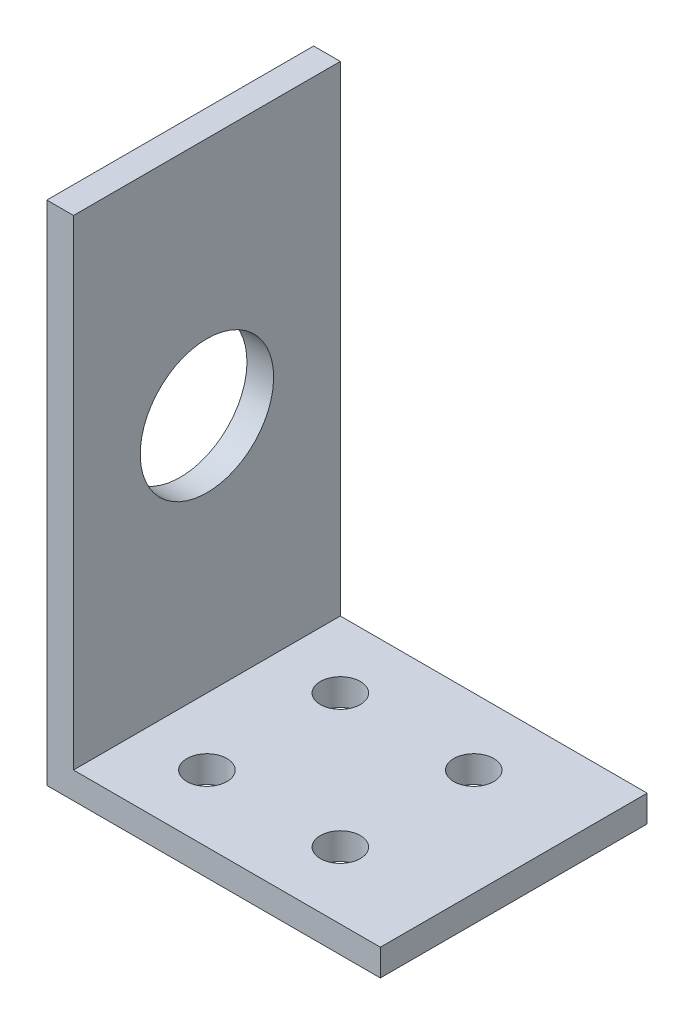
ISO-10303-21;
HEADER;
FILE_DESCRIPTION(('STEP AP214'),'2;1');
FILE_NAME('part.step','',(''),(''),'','','');
FILE_SCHEMA(('AUTOMOTIVE_DESIGN { 1 0 10303 214 1 1 1 1 }'));
ENDSEC;
DATA;
#1=APPLICATION_CONTEXT('core data for automotive mechanical design processes');
#2=APPLICATION_PROTOCOL_DEFINITION('international standard','automotive_design',2000,#1);
#3=PRODUCT_CONTEXT('',#1,'mechanical');
#4=PRODUCT('Part','Part','',(#3));
#5=PRODUCT_RELATED_PRODUCT_CATEGORY('part','',(#4));
#6=PRODUCT_DEFINITION_FORMATION('','',#4);
#7=PRODUCT_DEFINITION_CONTEXT('part definition',#1,'design');
#8=PRODUCT_DEFINITION('design','',#6,#7);
#9=PRODUCT_DEFINITION_SHAPE('','',#8);
#10=(LENGTH_UNIT() NAMED_UNIT(*) SI_UNIT(.MILLI.,.METRE.));
#11=(NAMED_UNIT(*) PLANE_ANGLE_UNIT() SI_UNIT($,.RADIAN.));
#12=(NAMED_UNIT(*) SI_UNIT($,.STERADIAN.) SOLID_ANGLE_UNIT());
#13=UNCERTAINTY_MEASURE_WITH_UNIT(LENGTH_MEASURE(1.E-05),#10,'distance_accuracy_value','');
#14=(GEOMETRIC_REPRESENTATION_CONTEXT(3) GLOBAL_UNCERTAINTY_ASSIGNED_CONTEXT((#13)) GLOBAL_UNIT_ASSIGNED_CONTEXT((#10,
#11,#12)) REPRESENTATION_CONTEXT('',''));
#15=CARTESIAN_POINT('',(0.,0.,0.));
#16=DIRECTION('',(0.,0.,1.));
#17=DIRECTION('',(1.,0.,0.));
#18=AXIS2_PLACEMENT_3D('',#15,#16,#17);
#19=CARTESIAN_POINT('',(2.,38.,20.));
#20=DIRECTION('',(0.,-1.,0.));
#21=DIRECTION('',(0.,0.,-1.));
#22=AXIS2_PLACEMENT_3D('',#19,#20,#21);
#23=PLANE('',#22);
#24=DIRECTION('',(-1.,0.,0.));
#25=VECTOR('',#24,1.);
#26=CARTESIAN_POINT('',(2.,38.,0.));
#27=LINE('',#26,#25);
#28=CARTESIAN_POINT('',(2.,38.,0.));
#29=VERTEX_POINT('',#28);
#30=CARTESIAN_POINT('',(0.,38.,0.));
#31=VERTEX_POINT('',#30);
#32=EDGE_CURVE('E128',#29,#31,#27,.T.);
#33=ORIENTED_EDGE('',*,*,#32,.T.);
#34=DIRECTION('',(0.,0.,-1.));
#35=VECTOR('',#34,1.);
#36=CARTESIAN_POINT('',(0.,38.,20.));
#37=LINE('',#36,#35);
#38=CARTESIAN_POINT('',(0.,38.,20.));
#39=VERTEX_POINT('',#38);
#40=EDGE_CURVE('E11',#39,#31,#37,.T.);
#41=ORIENTED_EDGE('',*,*,#40,.F.);
#42=DIRECTION('',(-1.,0.,0.));
#43=VECTOR('',#42,1.);
#44=CARTESIAN_POINT('',(2.,38.,20.));
#45=LINE('',#44,#43);
#46=CARTESIAN_POINT('',(2.,38.,20.));
#47=VERTEX_POINT('',#46);
#48=EDGE_CURVE('E145',#47,#39,#45,.T.);
#49=ORIENTED_EDGE('',*,*,#48,.F.);
#50=DIRECTION('',(0.,0.,-1.));
#51=VECTOR('',#50,1.);
#52=CARTESIAN_POINT('',(2.,38.,20.));
#53=LINE('',#52,#51);
#54=EDGE_CURVE('E124',#47,#29,#53,.T.);
#55=ORIENTED_EDGE('',*,*,#54,.T.);
#56=EDGE_LOOP('',(#33,#41,#49,#55));
#57=FACE_BOUND('',#56,.T.);
#58=ADVANCED_FACE('F39',(#57),#23,.F.);
#59=CARTESIAN_POINT('',(0.,38.,20.));
#60=DIRECTION('',(1.,0.,0.));
#61=DIRECTION('',(0.,1.,0.));
#62=AXIS2_PLACEMENT_3D('',#59,#60,#61);
#63=PLANE('',#62);
#64=CARTESIAN_POINT('',(0.,20.,10.));
#65=DIRECTION('',(1.,0.,0.));
#66=DIRECTION('',(0.,1.,0.));
#67=AXIS2_PLACEMENT_3D('',#64,#65,#66);
#68=CIRCLE('',#67,5.);
#69=CARTESIAN_POINT('',(0.,25.,10.));
#70=VERTEX_POINT('',#69);
#71=EDGE_CURVE('E279',#70,#70,#68,.T.);
#72=ORIENTED_EDGE('',*,*,#71,.T.);
#73=EDGE_LOOP('',(#72));
#74=FACE_BOUND('',#73,.T.);
#75=DIRECTION('',(0.,-1.,0.));
#76=VECTOR('',#75,1.);
#77=CARTESIAN_POINT('',(0.,38.,0.));
#78=LINE('',#77,#76);
#79=CARTESIAN_POINT('',(0.,0.,0.));
#80=VERTEX_POINT('',#79);
#81=EDGE_CURVE('E132',#31,#80,#78,.T.);
#82=ORIENTED_EDGE('',*,*,#81,.T.);
#83=DIRECTION('',(0.,0.,-1.));
#84=VECTOR('',#83,1.);
#85=CARTESIAN_POINT('',(0.,0.,20.));
#86=LINE('',#85,#84);
#87=CARTESIAN_POINT('',(0.,0.,20.));
#88=VERTEX_POINT('',#87);
#89=EDGE_CURVE('E48',#88,#80,#86,.T.);
#90=ORIENTED_EDGE('',*,*,#89,.F.);
#91=DIRECTION('',(0.,-1.,0.));
#92=VECTOR('',#91,1.);
#93=CARTESIAN_POINT('',(0.,38.,20.));
#94=LINE('',#93,#92);
#95=EDGE_CURVE('E93',#39,#88,#94,.T.);
#96=ORIENTED_EDGE('',*,*,#95,.F.);
#97=ORIENTED_EDGE('',*,*,#40,.T.);
#98=EDGE_LOOP('',(#82,#90,#96,#97));
#99=FACE_BOUND('',#98,.T.);
#100=ADVANCED_FACE('F176',(#74,#99),#63,.F.);
#101=CARTESIAN_POINT('',(0.,0.,20.));
#102=DIRECTION('',(0.,1.,0.));
#103=DIRECTION('',(0.,0.,1.));
#104=AXIS2_PLACEMENT_3D('',#101,#102,#103);
#105=PLANE('',#104);
#106=CARTESIAN_POINT('',(17.,0.,15.));
#107=DIRECTION('',(0.,1.,0.));
#108=DIRECTION('',(0.,0.,1.));
#109=AXIS2_PLACEMENT_3D('',#106,#107,#108);
#110=CIRCLE('',#109,1.5);
#111=CARTESIAN_POINT('',(17.,0.,16.5));
#112=VERTEX_POINT('',#111);
#113=EDGE_CURVE('E305',#112,#112,#110,.T.);
#114=ORIENTED_EDGE('',*,*,#113,.T.);
#115=EDGE_LOOP('',(#114));
#116=FACE_BOUND('',#115,.T.);
#117=CARTESIAN_POINT('',(7.,0.,5.));
#118=DIRECTION('',(0.,1.,0.));
#119=DIRECTION('',(0.,0.,1.));
#120=AXIS2_PLACEMENT_3D('',#117,#118,#119);
#121=CIRCLE('',#120,1.5);
#122=CARTESIAN_POINT('',(7.,0.,6.5));
#123=VERTEX_POINT('',#122);
#124=EDGE_CURVE('E301',#123,#123,#121,.T.);
#125=ORIENTED_EDGE('',*,*,#124,.T.);
#126=EDGE_LOOP('',(#125));
#127=FACE_BOUND('',#126,.T.);
#128=CARTESIAN_POINT('',(7.,0.,15.));
#129=DIRECTION('',(0.,1.,0.));
#130=DIRECTION('',(0.,0.,1.));
#131=AXIS2_PLACEMENT_3D('',#128,#129,#130);
#132=CIRCLE('',#131,1.5);
#133=CARTESIAN_POINT('',(7.,0.,16.5));
#134=VERTEX_POINT('',#133);
#135=EDGE_CURVE('E294',#134,#134,#132,.T.);
#136=ORIENTED_EDGE('',*,*,#135,.T.);
#137=EDGE_LOOP('',(#136));
#138=FACE_BOUND('',#137,.T.);
#139=CARTESIAN_POINT('',(17.,0.,5.));
#140=DIRECTION('',(0.,1.,0.));
#141=DIRECTION('',(0.,0.,1.));
#142=AXIS2_PLACEMENT_3D('',#139,#140,#141);
#143=CIRCLE('',#142,1.5);
#144=CARTESIAN_POINT('',(17.,0.,6.5));
#145=VERTEX_POINT('',#144);
#146=EDGE_CURVE('E133',#145,#145,#143,.T.);
#147=ORIENTED_EDGE('',*,*,#146,.T.);
#148=EDGE_LOOP('',(#147));
#149=FACE_BOUND('',#148,.T.);
#150=DIRECTION('',(1.,0.,0.));
#151=VECTOR('',#150,1.);
#152=CARTESIAN_POINT('',(0.,0.,0.));
#153=LINE('',#152,#151);
#154=CARTESIAN_POINT('',(25.,0.,0.));
#155=VERTEX_POINT('',#154);
#156=EDGE_CURVE('E136',#80,#155,#153,.T.);
#157=ORIENTED_EDGE('',*,*,#156,.T.);
#158=DIRECTION('',(0.,0.,-1.));
#159=VECTOR('',#158,1.);
#160=CARTESIAN_POINT('',(25.,0.,20.));
#161=LINE('',#160,#159);
#162=CARTESIAN_POINT('',(25.,0.,20.));
#163=VERTEX_POINT('',#162);
#164=EDGE_CURVE('E117',#163,#155,#161,.T.);
#165=ORIENTED_EDGE('',*,*,#164,.F.);
#166=DIRECTION('',(1.,0.,0.));
#167=VECTOR('',#166,1.);
#168=CARTESIAN_POINT('',(0.,0.,20.));
#169=LINE('',#168,#167);
#170=EDGE_CURVE('E106',#88,#163,#169,.T.);
#171=ORIENTED_EDGE('',*,*,#170,.F.);
#172=ORIENTED_EDGE('',*,*,#89,.T.);
#173=EDGE_LOOP('',(#157,#165,#171,#172));
#174=FACE_BOUND('',#173,.T.);
#175=ADVANCED_FACE('F155',(#116,#127,#138,#149,#174),#105,.F.);
#176=CARTESIAN_POINT('',(25.,0.,20.));
#177=DIRECTION('',(-1.,0.,0.));
#178=DIRECTION('',(0.,0.,1.));
#179=AXIS2_PLACEMENT_3D('',#176,#177,#178);
#180=PLANE('',#179);
#181=DIRECTION('',(0.,1.,0.));
#182=VECTOR('',#181,1.);
#183=CARTESIAN_POINT('',(25.,0.,0.));
#184=LINE('',#183,#182);
#185=CARTESIAN_POINT('',(25.,2.,0.));
#186=VERTEX_POINT('',#185);
#187=EDGE_CURVE('E115',#155,#186,#184,.T.);
#188=ORIENTED_EDGE('',*,*,#187,.T.);
#189=DIRECTION('',(0.,0.,-1.));
#190=VECTOR('',#189,1.);
#191=CARTESIAN_POINT('',(25.,2.,20.));
#192=LINE('',#191,#190);
#193=CARTESIAN_POINT('',(25.,2.,20.));
#194=VERTEX_POINT('',#193);
#195=EDGE_CURVE('E112',#194,#186,#192,.T.);
#196=ORIENTED_EDGE('',*,*,#195,.F.);
#197=DIRECTION('',(0.,1.,0.));
#198=VECTOR('',#197,1.);
#199=CARTESIAN_POINT('',(25.,0.,20.));
#200=LINE('',#199,#198);
#201=EDGE_CURVE('E100',#163,#194,#200,.T.);
#202=ORIENTED_EDGE('',*,*,#201,.F.);
#203=ORIENTED_EDGE('',*,*,#164,.T.);
#204=EDGE_LOOP('',(#188,#196,#202,#203));
#205=FACE_BOUND('',#204,.T.);
#206=ADVANCED_FACE('F113',(#205),#180,.F.);
#207=CARTESIAN_POINT('',(25.,2.,20.));
#208=DIRECTION('',(0.,-1.,0.));
#209=DIRECTION('',(1.,0.,0.));
#210=AXIS2_PLACEMENT_3D('',#207,#208,#209);
#211=PLANE('',#210);
#212=CARTESIAN_POINT('',(17.,2.,15.));
#213=DIRECTION('',(0.,1.,0.));
#214=DIRECTION('',(-1.,0.,0.));
#215=AXIS2_PLACEMENT_3D('',#212,#213,#214);
#216=CIRCLE('',#215,1.5);
#217=CARTESIAN_POINT('',(15.5,2.,15.));
#218=VERTEX_POINT('',#217);
#219=EDGE_CURVE('E290',#218,#218,#216,.T.);
#220=ORIENTED_EDGE('',*,*,#219,.F.);
#221=EDGE_LOOP('',(#220));
#222=FACE_BOUND('',#221,.T.);
#223=CARTESIAN_POINT('',(7.,2.,5.));
#224=DIRECTION('',(0.,1.,0.));
#225=DIRECTION('',(-1.,0.,0.));
#226=AXIS2_PLACEMENT_3D('',#223,#224,#225);
#227=CIRCLE('',#226,1.5);
#228=CARTESIAN_POINT('',(5.5,2.,5.));
#229=VERTEX_POINT('',#228);
#230=EDGE_CURVE('E286',#229,#229,#227,.T.);
#231=ORIENTED_EDGE('',*,*,#230,.F.);
#232=EDGE_LOOP('',(#231));
#233=FACE_BOUND('',#232,.T.);
#234=CARTESIAN_POINT('',(7.,2.,15.));
#235=DIRECTION('',(0.,1.,0.));
#236=DIRECTION('',(-1.,0.,0.));
#237=AXIS2_PLACEMENT_3D('',#234,#235,#236);
#238=CIRCLE('',#237,1.5);
#239=CARTESIAN_POINT('',(5.5,2.,15.));
#240=VERTEX_POINT('',#239);
#241=EDGE_CURVE('E281',#240,#240,#238,.T.);
#242=ORIENTED_EDGE('',*,*,#241,.F.);
#243=EDGE_LOOP('',(#242));
#244=FACE_BOUND('',#243,.T.);
#245=CARTESIAN_POINT('',(17.,2.,5.));
#246=DIRECTION('',(0.,1.,0.));
#247=DIRECTION('',(-1.,0.,0.));
#248=AXIS2_PLACEMENT_3D('',#245,#246,#247);
#249=CIRCLE('',#248,1.5);
#250=CARTESIAN_POINT('',(15.5,2.,5.));
#251=VERTEX_POINT('',#250);
#252=EDGE_CURVE('E309',#251,#251,#249,.T.);
#253=ORIENTED_EDGE('',*,*,#252,.F.);
#254=EDGE_LOOP('',(#253));
#255=FACE_BOUND('',#254,.T.);
#256=DIRECTION('',(-1.,0.,0.));
#257=VECTOR('',#256,1.);
#258=CARTESIAN_POINT('',(25.,2.,0.));
#259=LINE('',#258,#257);
#260=CARTESIAN_POINT('',(2.,2.,0.));
#261=VERTEX_POINT('',#260);
#262=EDGE_CURVE('E79',#186,#261,#259,.T.);
#263=ORIENTED_EDGE('',*,*,#262,.T.);
#264=DIRECTION('',(0.,0.,-1.));
#265=VECTOR('',#264,1.);
#266=CARTESIAN_POINT('',(2.,2.,20.));
#267=LINE('',#266,#265);
#268=CARTESIAN_POINT('',(2.,2.,20.));
#269=VERTEX_POINT('',#268);
#270=EDGE_CURVE('E118',#269,#261,#267,.T.);
#271=ORIENTED_EDGE('',*,*,#270,.F.);
#272=DIRECTION('',(-1.,0.,0.));
#273=VECTOR('',#272,1.);
#274=CARTESIAN_POINT('',(25.,2.,20.));
#275=LINE('',#274,#273);
#276=EDGE_CURVE('E104',#194,#269,#275,.T.);
#277=ORIENTED_EDGE('',*,*,#276,.F.);
#278=ORIENTED_EDGE('',*,*,#195,.T.);
#279=EDGE_LOOP('',(#263,#271,#277,#278));
#280=FACE_BOUND('',#279,.T.);
#281=ADVANCED_FACE('F120',(#222,#233,#244,#255,#280),#211,.F.);
#282=CARTESIAN_POINT('',(2.,2.,20.));
#283=DIRECTION('',(-1.,0.,0.));
#284=DIRECTION('',(0.,-1.,0.));
#285=AXIS2_PLACEMENT_3D('',#282,#283,#284);
#286=PLANE('',#285);
#287=CARTESIAN_POINT('',(2.,20.,10.));
#288=DIRECTION('',(1.,0.,0.));
#289=DIRECTION('',(0.,1.,0.));
#290=AXIS2_PLACEMENT_3D('',#287,#288,#289);
#291=CIRCLE('',#290,5.);
#292=CARTESIAN_POINT('',(2.,25.,10.));
#293=VERTEX_POINT('',#292);
#294=EDGE_CURVE('E277',#293,#293,#291,.T.);
#295=ORIENTED_EDGE('',*,*,#294,.F.);
#296=EDGE_LOOP('',(#295));
#297=FACE_BOUND('',#296,.T.);
#298=DIRECTION('',(0.,1.,0.));
#299=VECTOR('',#298,1.);
#300=CARTESIAN_POINT('',(2.,2.,0.));
#301=LINE('',#300,#299);
#302=EDGE_CURVE('E85',#261,#29,#301,.T.);
#303=ORIENTED_EDGE('',*,*,#302,.T.);
#304=ORIENTED_EDGE('',*,*,#54,.F.);
#305=DIRECTION('',(0.,1.,0.));
#306=VECTOR('',#305,1.);
#307=CARTESIAN_POINT('',(2.,2.,20.));
#308=LINE('',#307,#306);
#309=EDGE_CURVE('E56',#269,#47,#308,.T.);
#310=ORIENTED_EDGE('',*,*,#309,.F.);
#311=ORIENTED_EDGE('',*,*,#270,.T.);
#312=EDGE_LOOP('',(#303,#304,#310,#311));
#313=FACE_BOUND('',#312,.T.);
#314=ADVANCED_FACE('F162',(#297,#313),#286,.F.);
#315=CARTESIAN_POINT('',(0.,0.,20.));
#316=DIRECTION('',(0.,0.,1.));
#317=DIRECTION('',(1.,0.,0.));
#318=AXIS2_PLACEMENT_3D('',#315,#316,#317);
#319=PLANE('',#318);
#320=ORIENTED_EDGE('',*,*,#48,.T.);
#321=ORIENTED_EDGE('',*,*,#95,.T.);
#322=ORIENTED_EDGE('',*,*,#170,.T.);
#323=ORIENTED_EDGE('',*,*,#201,.T.);
#324=ORIENTED_EDGE('',*,*,#276,.T.);
#325=ORIENTED_EDGE('',*,*,#309,.T.);
#326=EDGE_LOOP('',(#320,#321,#322,#323,#324,#325));
#327=FACE_BOUND('',#326,.T.);
#328=ADVANCED_FACE('F102',(#327),#319,.T.);
#329=CARTESIAN_POINT('',(0.,0.,0.));
#330=DIRECTION('',(0.,0.,1.));
#331=DIRECTION('',(1.,0.,0.));
#332=AXIS2_PLACEMENT_3D('',#329,#330,#331);
#333=PLANE('',#332);
#334=ORIENTED_EDGE('',*,*,#32,.F.);
#335=ORIENTED_EDGE('',*,*,#302,.F.);
#336=ORIENTED_EDGE('',*,*,#262,.F.);
#337=ORIENTED_EDGE('',*,*,#187,.F.);
#338=ORIENTED_EDGE('',*,*,#156,.F.);
#339=ORIENTED_EDGE('',*,*,#81,.F.);
#340=EDGE_LOOP('',(#334,#335,#336,#337,#338,#339));
#341=FACE_BOUND('',#340,.T.);
#342=ADVANCED_FACE('F158',(#341),#333,.F.);
#343=CARTESIAN_POINT('',(17.,-18.,5.));
#344=DIRECTION('',(0.,1.,0.));
#345=DIRECTION('',(-1.,0.,0.));
#346=AXIS2_PLACEMENT_3D('',#343,#344,#345);
#347=CYLINDRICAL_SURFACE('',#346,1.5);
#348=ORIENTED_EDGE('',*,*,#252,.T.);
#349=EDGE_LOOP('',(#348));
#350=FACE_BOUND('',#349,.T.);
#351=ORIENTED_EDGE('',*,*,#146,.F.);
#352=EDGE_LOOP('',(#351));
#353=FACE_BOUND('',#352,.T.);
#354=ADVANCED_FACE('F207',(#350,#353),#347,.F.);
#355=CARTESIAN_POINT('',(7.00000000000001,-18.,15.));
#356=DIRECTION('',(0.,1.,0.));
#357=DIRECTION('',(-1.,0.,0.));
#358=AXIS2_PLACEMENT_3D('',#355,#356,#357);
#359=CYLINDRICAL_SURFACE('',#358,1.5);
#360=ORIENTED_EDGE('',*,*,#241,.T.);
#361=EDGE_LOOP('',(#360));
#362=FACE_BOUND('',#361,.T.);
#363=ORIENTED_EDGE('',*,*,#135,.F.);
#364=EDGE_LOOP('',(#363));
#365=FACE_BOUND('',#364,.T.);
#366=ADVANCED_FACE('F212',(#362,#365),#359,.F.);
#367=CARTESIAN_POINT('',(7.00000000000001,-18.,5.));
#368=DIRECTION('',(0.,1.,0.));
#369=DIRECTION('',(-1.,0.,0.));
#370=AXIS2_PLACEMENT_3D('',#367,#368,#369);
#371=CYLINDRICAL_SURFACE('',#370,1.5);
#372=ORIENTED_EDGE('',*,*,#230,.T.);
#373=EDGE_LOOP('',(#372));
#374=FACE_BOUND('',#373,.T.);
#375=ORIENTED_EDGE('',*,*,#124,.F.);
#376=EDGE_LOOP('',(#375));
#377=FACE_BOUND('',#376,.T.);
#378=ADVANCED_FACE('F224',(#374,#377),#371,.F.);
#379=CARTESIAN_POINT('',(17.,-18.,15.));
#380=DIRECTION('',(0.,1.,0.));
#381=DIRECTION('',(-1.,0.,0.));
#382=AXIS2_PLACEMENT_3D('',#379,#380,#381);
#383=CYLINDRICAL_SURFACE('',#382,1.5);
#384=ORIENTED_EDGE('',*,*,#219,.T.);
#385=EDGE_LOOP('',(#384));
#386=FACE_BOUND('',#385,.T.);
#387=ORIENTED_EDGE('',*,*,#113,.F.);
#388=EDGE_LOOP('',(#387));
#389=FACE_BOUND('',#388,.T.);
#390=ADVANCED_FACE('F234',(#386,#389),#383,.F.);
#391=CARTESIAN_POINT('',(-18.,20.,10.));
#392=DIRECTION('',(1.,0.,0.));
#393=DIRECTION('',(0.,1.,0.));
#394=AXIS2_PLACEMENT_3D('',#391,#392,#393);
#395=CYLINDRICAL_SURFACE('',#394,5.);
#396=ORIENTED_EDGE('',*,*,#294,.T.);
#397=EDGE_LOOP('',(#396));
#398=FACE_BOUND('',#397,.T.);
#399=ORIENTED_EDGE('',*,*,#71,.F.);
#400=EDGE_LOOP('',(#399));
#401=FACE_BOUND('',#400,.T.);
#402=ADVANCED_FACE('F243',(#398,#401),#395,.F.);
#403=CLOSED_SHELL('',(#58,#100,#175,#206,#281,#314,#328,#342,#354,#366,#378,#390,#402));
#404=MANIFOLD_SOLID_BREP('B2',#403);
#405=ADVANCED_BREP_SHAPE_REPRESENTATION('',(#18,#404),#14);
#406=SHAPE_DEFINITION_REPRESENTATION(#9,#405);
ENDSEC;
END-ISO-10303-21;
